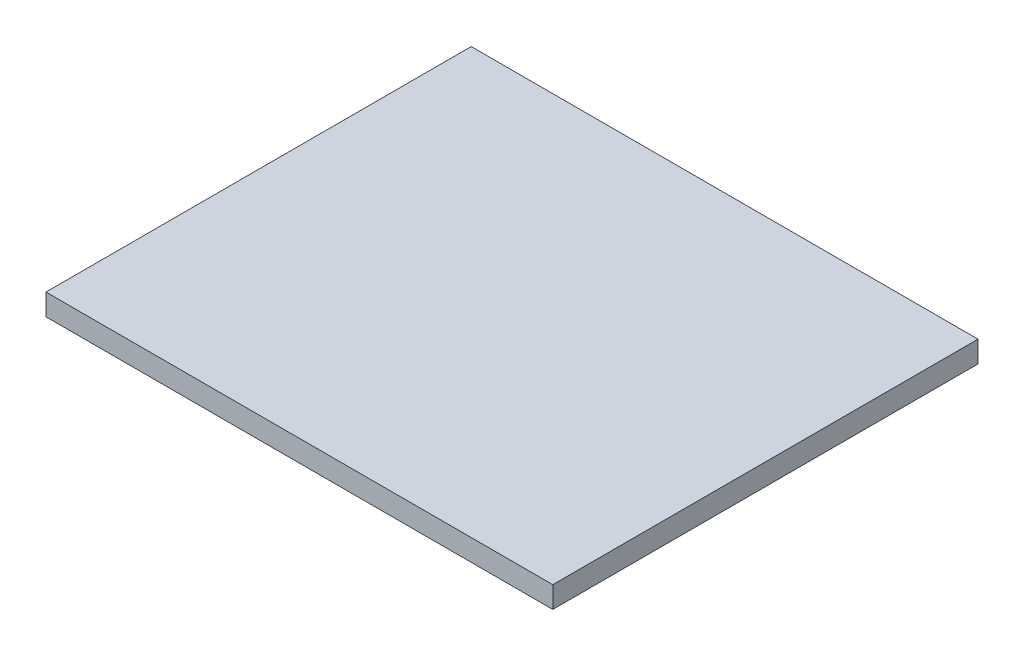
ISO-10303-21;
HEADER;
FILE_DESCRIPTION(('STEP AP214'),'2;1');
FILE_NAME('part.step','',(''),(''),'','','');
FILE_SCHEMA(('AUTOMOTIVE_DESIGN { 1 0 10303 214 1 1 1 1 }'));
ENDSEC;
DATA;
#1=APPLICATION_CONTEXT('core data for automotive mechanical design processes');
#2=APPLICATION_PROTOCOL_DEFINITION('international standard','automotive_design',2000,#1);
#3=PRODUCT_CONTEXT('',#1,'mechanical');
#4=PRODUCT('Part','Part','',(#3));
#5=PRODUCT_RELATED_PRODUCT_CATEGORY('part','',(#4));
#6=PRODUCT_DEFINITION_FORMATION('','',#4);
#7=PRODUCT_DEFINITION_CONTEXT('part definition',#1,'design');
#8=PRODUCT_DEFINITION('design','',#6,#7);
#9=PRODUCT_DEFINITION_SHAPE('','',#8);
#10=(LENGTH_UNIT() NAMED_UNIT(*) SI_UNIT(.MILLI.,.METRE.));
#11=(NAMED_UNIT(*) PLANE_ANGLE_UNIT() SI_UNIT($,.RADIAN.));
#12=(NAMED_UNIT(*) SI_UNIT($,.STERADIAN.) SOLID_ANGLE_UNIT());
#13=UNCERTAINTY_MEASURE_WITH_UNIT(LENGTH_MEASURE(1.E-05),#10,'distance_accuracy_value','');
#14=(GEOMETRIC_REPRESENTATION_CONTEXT(3) GLOBAL_UNCERTAINTY_ASSIGNED_CONTEXT((#13)) GLOBAL_UNIT_ASSIGNED_CONTEXT((#10,
#11,#12)) REPRESENTATION_CONTEXT('',''));
#15=CARTESIAN_POINT('',(0.,0.,0.));
#16=DIRECTION('',(0.,0.,1.));
#17=DIRECTION('',(1.,0.,0.));
#18=AXIS2_PLACEMENT_3D('',#15,#16,#17);
#19=CARTESIAN_POINT('',(0.,0.,0.));
#20=DIRECTION('',(0.,1.,0.));
#21=DIRECTION('',(0.,0.,1.));
#22=AXIS2_PLACEMENT_3D('',#19,#20,#21);
#23=PLANE('',#22);
#24=DIRECTION('',(0.,0.,-1.));
#25=VECTOR('',#24,1.);
#26=CARTESIAN_POINT('',(29.5,0.,-24.75));
#27=LINE('',#26,#25);
#28=CARTESIAN_POINT('',(29.5,0.,24.75));
#29=VERTEX_POINT('',#28);
#30=CARTESIAN_POINT('',(29.5,0.,-24.75));
#31=VERTEX_POINT('',#30);
#32=EDGE_CURVE('E143',#29,#31,#27,.T.);
#33=ORIENTED_EDGE('',*,*,#32,.F.);
#34=DIRECTION('',(1.,0.,0.));
#35=VECTOR('',#34,1.);
#36=CARTESIAN_POINT('',(-29.5,0.,24.75));
#37=LINE('',#36,#35);
#38=CARTESIAN_POINT('',(-29.5,0.,24.75));
#39=VERTEX_POINT('',#38);
#40=EDGE_CURVE('E149',#39,#29,#37,.T.);
#41=ORIENTED_EDGE('',*,*,#40,.F.);
#42=DIRECTION('',(0.,0.,1.));
#43=VECTOR('',#42,1.);
#44=CARTESIAN_POINT('',(-29.5,0.,-24.75));
#45=LINE('',#44,#43);
#46=CARTESIAN_POINT('',(-29.5,0.,-24.75));
#47=VERTEX_POINT('',#46);
#48=EDGE_CURVE('E147',#47,#39,#45,.T.);
#49=ORIENTED_EDGE('',*,*,#48,.F.);
#50=DIRECTION('',(-1.,0.,0.));
#51=VECTOR('',#50,1.);
#52=CARTESIAN_POINT('',(-29.5,0.,-24.75));
#53=LINE('',#52,#51);
#54=EDGE_CURVE('E124',#31,#47,#53,.T.);
#55=ORIENTED_EDGE('',*,*,#54,.F.);
#56=EDGE_LOOP('',(#33,#41,#49,#55));
#57=FACE_BOUND('',#56,.T.);
#58=DIRECTION('',(0.,0.,-1.));
#59=VECTOR('',#58,1.);
#60=CARTESIAN_POINT('',(-1.75,0.,2.43669858620224));
#61=LINE('',#60,#59);
#62=CARTESIAN_POINT('',(-1.75,0.,6.50000000000001));
#63=VERTEX_POINT('',#62);
#64=CARTESIAN_POINT('',(-1.75,0.,2.43669858620224));
#65=VERTEX_POINT('',#64);
#66=EDGE_CURVE('E53',#63,#65,#61,.T.);
#67=ORIENTED_EDGE('',*,*,#66,.F.);
#68=DIRECTION('',(1.,0.,0.));
#69=VECTOR('',#68,1.);
#70=CARTESIAN_POINT('',(0.,0.,6.50000000000001));
#71=LINE('',#70,#69);
#72=CARTESIAN_POINT('',(1.75,0.,6.50000000000001));
#73=VERTEX_POINT('',#72);
#74=EDGE_CURVE('E156',#63,#73,#71,.T.);
#75=ORIENTED_EDGE('',*,*,#74,.T.);
#76=DIRECTION('',(0.,0.,1.));
#77=VECTOR('',#76,1.);
#78=CARTESIAN_POINT('',(1.75,0.,2.43669858620224));
#79=LINE('',#78,#77);
#80=CARTESIAN_POINT('',(1.75,0.,2.43669858620224));
#81=VERTEX_POINT('',#80);
#82=EDGE_CURVE('E60',#81,#73,#79,.T.);
#83=ORIENTED_EDGE('',*,*,#82,.F.);
#84=CARTESIAN_POINT('',(0.,0.,0.));
#85=DIRECTION('',(0.,1.,0.));
#86=DIRECTION('',(0.,0.,1.));
#87=AXIS2_PLACEMENT_3D('',#84,#85,#86);
#88=CIRCLE('',#87,3.);
#89=EDGE_CURVE('E135',#81,#65,#88,.T.);
#90=ORIENTED_EDGE('',*,*,#89,.T.);
#91=EDGE_LOOP('',(#67,#75,#83,#90));
#92=FACE_BOUND('',#91,.T.);
#93=ADVANCED_FACE('F37',(#57,#92),#23,.F.);
#94=CARTESIAN_POINT('',(29.5,1.5,-24.75));
#95=DIRECTION('',(-1.,0.,0.));
#96=DIRECTION('',(0.,0.,1.));
#97=AXIS2_PLACEMENT_3D('',#94,#95,#96);
#98=PLANE('',#97);
#99=ORIENTED_EDGE('',*,*,#32,.T.);
#100=DIRECTION('',(0.,-1.,0.));
#101=VECTOR('',#100,1.);
#102=CARTESIAN_POINT('',(29.5,1.5,-24.75));
#103=LINE('',#102,#101);
#104=CARTESIAN_POINT('',(29.5,2.5,-24.75));
#105=VERTEX_POINT('',#104);
#106=EDGE_CURVE('E127',#105,#31,#103,.T.);
#107=ORIENTED_EDGE('',*,*,#106,.F.);
#108=DIRECTION('',(0.,0.,-1.));
#109=VECTOR('',#108,1.);
#110=CARTESIAN_POINT('',(29.5,2.5,83.8029423483707));
#111=LINE('',#110,#109);
#112=CARTESIAN_POINT('',(29.5,2.5,24.75));
#113=VERTEX_POINT('',#112);
#114=EDGE_CURVE('E114',#113,#105,#111,.T.);
#115=ORIENTED_EDGE('',*,*,#114,.F.);
#116=DIRECTION('',(0.,-1.,0.));
#117=VECTOR('',#116,1.);
#118=CARTESIAN_POINT('',(29.5,1.5,24.75));
#119=LINE('',#118,#117);
#120=EDGE_CURVE('E151',#113,#29,#119,.T.);
#121=ORIENTED_EDGE('',*,*,#120,.T.);
#122=EDGE_LOOP('',(#99,#107,#115,#121));
#123=FACE_BOUND('',#122,.T.);
#124=ADVANCED_FACE('F212',(#123),#98,.F.);
#125=CARTESIAN_POINT('',(-29.5,1.5,-24.75));
#126=DIRECTION('',(0.,0.,1.));
#127=DIRECTION('',(1.,0.,0.));
#128=AXIS2_PLACEMENT_3D('',#125,#126,#127);
#129=PLANE('',#128);
#130=DIRECTION('',(0.,-1.,0.));
#131=VECTOR('',#130,1.);
#132=CARTESIAN_POINT('',(-29.5,1.5,-24.75));
#133=LINE('',#132,#131);
#134=CARTESIAN_POINT('',(-29.5,2.5,-24.75));
#135=VERTEX_POINT('',#134);
#136=EDGE_CURVE('E122',#135,#47,#133,.T.);
#137=ORIENTED_EDGE('',*,*,#136,.F.);
#138=DIRECTION('',(1.,0.,0.));
#139=VECTOR('',#138,1.);
#140=CARTESIAN_POINT('',(-29.5,2.5,-24.75));
#141=LINE('',#140,#139);
#142=EDGE_CURVE('E107',#135,#105,#141,.T.);
#143=ORIENTED_EDGE('',*,*,#142,.T.);
#144=ORIENTED_EDGE('',*,*,#106,.T.);
#145=ORIENTED_EDGE('',*,*,#54,.T.);
#146=EDGE_LOOP('',(#137,#143,#144,#145));
#147=FACE_BOUND('',#146,.T.);
#148=ADVANCED_FACE('F123',(#147),#129,.F.);
#149=CARTESIAN_POINT('',(-29.5,1.5,-24.75));
#150=DIRECTION('',(1.,0.,0.));
#151=DIRECTION('',(0.,0.,-1.));
#152=AXIS2_PLACEMENT_3D('',#149,#150,#151);
#153=PLANE('',#152);
#154=ORIENTED_EDGE('',*,*,#48,.T.);
#155=DIRECTION('',(0.,-1.,0.));
#156=VECTOR('',#155,1.);
#157=CARTESIAN_POINT('',(-29.5,1.5,24.75));
#158=LINE('',#157,#156);
#159=CARTESIAN_POINT('',(-29.5,2.5,24.75));
#160=VERTEX_POINT('',#159);
#161=EDGE_CURVE('E128',#160,#39,#158,.T.);
#162=ORIENTED_EDGE('',*,*,#161,.F.);
#163=DIRECTION('',(0.,0.,-1.));
#164=VECTOR('',#163,1.);
#165=CARTESIAN_POINT('',(-29.5,2.5,83.8029423483707));
#166=LINE('',#165,#164);
#167=EDGE_CURVE('E111',#160,#135,#166,.T.);
#168=ORIENTED_EDGE('',*,*,#167,.T.);
#169=ORIENTED_EDGE('',*,*,#136,.T.);
#170=EDGE_LOOP('',(#154,#162,#168,#169));
#171=FACE_BOUND('',#170,.T.);
#172=ADVANCED_FACE('F131',(#171),#153,.F.);
#173=CARTESIAN_POINT('',(-29.5,1.5,24.75));
#174=DIRECTION('',(0.,0.,-1.));
#175=DIRECTION('',(-1.,0.,0.));
#176=AXIS2_PLACEMENT_3D('',#173,#174,#175);
#177=PLANE('',#176);
#178=ORIENTED_EDGE('',*,*,#120,.F.);
#179=DIRECTION('',(1.,0.,0.));
#180=VECTOR('',#179,1.);
#181=CARTESIAN_POINT('',(-29.5,2.5,24.75));
#182=LINE('',#181,#180);
#183=EDGE_CURVE('E119',#160,#113,#182,.T.);
#184=ORIENTED_EDGE('',*,*,#183,.F.);
#185=ORIENTED_EDGE('',*,*,#161,.T.);
#186=ORIENTED_EDGE('',*,*,#40,.T.);
#187=EDGE_LOOP('',(#178,#184,#185,#186));
#188=FACE_BOUND('',#187,.T.);
#189=ADVANCED_FACE('F222',(#188),#177,.F.);
#190=CARTESIAN_POINT('',(0.,1.5,0.));
#191=DIRECTION('',(0.,-1.,0.));
#192=DIRECTION('',(0.,0.,-1.));
#193=AXIS2_PLACEMENT_3D('',#190,#191,#192);
#194=CYLINDRICAL_SURFACE('',#193,3.);
#195=CARTESIAN_POINT('',(0.,1.,0.));
#196=DIRECTION('',(0.,-1.,0.));
#197=DIRECTION('',(0.,0.,-1.));
#198=AXIS2_PLACEMENT_3D('',#195,#196,#197);
#199=CIRCLE('',#198,3.);
#200=CARTESIAN_POINT('',(-1.75,1.,2.43669858620224));
#201=VERTEX_POINT('',#200);
#202=CARTESIAN_POINT('',(1.75,1.,2.43669858620224));
#203=VERTEX_POINT('',#202);
#204=EDGE_CURVE('E169',#201,#203,#199,.T.);
#205=ORIENTED_EDGE('',*,*,#204,.F.);
#206=DIRECTION('',(0.,-1.,0.));
#207=VECTOR('',#206,1.);
#208=CARTESIAN_POINT('',(-1.75,1.,2.43669858620224));
#209=LINE('',#208,#207);
#210=EDGE_CURVE('E133',#201,#65,#209,.T.);
#211=ORIENTED_EDGE('',*,*,#210,.T.);
#212=ORIENTED_EDGE('',*,*,#89,.F.);
#213=DIRECTION('',(0.,-1.,0.));
#214=VECTOR('',#213,1.);
#215=CARTESIAN_POINT('',(1.75,1.,2.43669858620224));
#216=LINE('',#215,#214);
#217=EDGE_CURVE('E138',#203,#81,#216,.T.);
#218=ORIENTED_EDGE('',*,*,#217,.F.);
#219=EDGE_LOOP('',(#205,#211,#212,#218));
#220=FACE_BOUND('',#219,.T.);
#221=ADVANCED_FACE('F174',(#220),#194,.F.);
#222=CARTESIAN_POINT('',(-1.75,1.,2.43669858620224));
#223=DIRECTION('',(-1.,0.,0.));
#224=DIRECTION('',(0.,0.,1.));
#225=AXIS2_PLACEMENT_3D('',#222,#223,#224);
#226=PLANE('',#225);
#227=ORIENTED_EDGE('',*,*,#66,.T.);
#228=ORIENTED_EDGE('',*,*,#210,.F.);
#229=DIRECTION('',(0.,-1.,0.));
#230=VECTOR('',#229,1.);
#231=CARTESIAN_POINT('',(-1.75,1.5,2.43669858620224));
#232=LINE('',#231,#230);
#233=CARTESIAN_POINT('',(-1.75,1.5,2.43669858620224));
#234=VERTEX_POINT('',#233);
#235=EDGE_CURVE('E176',#234,#201,#232,.T.);
#236=ORIENTED_EDGE('',*,*,#235,.F.);
#237=DIRECTION('',(0.,0.,-1.));
#238=VECTOR('',#237,1.);
#239=CARTESIAN_POINT('',(-1.75,1.5,5.));
#240=LINE('',#239,#238);
#241=CARTESIAN_POINT('',(-1.75,1.5,5.));
#242=VERTEX_POINT('',#241);
#243=EDGE_CURVE('E163',#242,#234,#240,.T.);
#244=ORIENTED_EDGE('',*,*,#243,.F.);
#245=DIRECTION('',(0.,0.707106781186546,-0.707106781186549));
#246=VECTOR('',#245,1.);
#247=CARTESIAN_POINT('',(-1.75,2.53165070689888,3.96834929310112));
#248=LINE('',#247,#246);
#249=EDGE_CURVE('E46',#242,#63,#248,.F.);
#250=ORIENTED_EDGE('',*,*,#249,.T.);
#251=EDGE_LOOP('',(#227,#228,#236,#244,#250));
#252=FACE_BOUND('',#251,.T.);
#253=ADVANCED_FACE('F160',(#252),#226,.F.);
#254=CARTESIAN_POINT('',(1.75,1.,2.43669858620224));
#255=DIRECTION('',(1.,0.,0.));
#256=DIRECTION('',(0.,0.,-1.));
#257=AXIS2_PLACEMENT_3D('',#254,#255,#256);
#258=PLANE('',#257);
#259=ORIENTED_EDGE('',*,*,#82,.T.);
#260=DIRECTION('',(0.,-0.707106781186546,0.707106781186549));
#261=VECTOR('',#260,1.);
#262=CARTESIAN_POINT('',(1.75,2.53165070689888,3.96834929310112));
#263=LINE('',#262,#261);
#264=CARTESIAN_POINT('',(1.75,1.5,5.));
#265=VERTEX_POINT('',#264);
#266=EDGE_CURVE('E11',#73,#265,#263,.F.);
#267=ORIENTED_EDGE('',*,*,#266,.T.);
#268=DIRECTION('',(0.,0.,1.));
#269=VECTOR('',#268,1.);
#270=CARTESIAN_POINT('',(1.75,1.5,5.));
#271=LINE('',#270,#269);
#272=CARTESIAN_POINT('',(1.75,1.5,2.43669858620224));
#273=VERTEX_POINT('',#272);
#274=EDGE_CURVE('E196',#273,#265,#271,.T.);
#275=ORIENTED_EDGE('',*,*,#274,.F.);
#276=DIRECTION('',(0.,-1.,0.));
#277=VECTOR('',#276,1.);
#278=CARTESIAN_POINT('',(1.75,1.5,2.43669858620224));
#279=LINE('',#278,#277);
#280=EDGE_CURVE('E181',#273,#203,#279,.T.);
#281=ORIENTED_EDGE('',*,*,#280,.T.);
#282=ORIENTED_EDGE('',*,*,#217,.T.);
#283=EDGE_LOOP('',(#259,#267,#275,#281,#282));
#284=FACE_BOUND('',#283,.T.);
#285=ADVANCED_FACE('F199',(#284),#258,.F.);
#286=CARTESIAN_POINT('',(0.,1.,0.));
#287=DIRECTION('',(0.,-1.,0.));
#288=DIRECTION('',(0.,0.,-1.));
#289=AXIS2_PLACEMENT_3D('',#286,#287,#288);
#290=PLANE('',#289);
#291=DIRECTION('',(1.,0.,0.));
#292=VECTOR('',#291,1.);
#293=CARTESIAN_POINT('',(1.75,1.,2.43669858620224));
#294=LINE('',#293,#292);
#295=EDGE_CURVE('E118',#201,#203,#294,.T.);
#296=ORIENTED_EDGE('',*,*,#295,.F.);
#297=ORIENTED_EDGE('',*,*,#204,.T.);
#298=EDGE_LOOP('',(#296,#297));
#299=FACE_BOUND('',#298,.T.);
#300=ADVANCED_FACE('F201',(#299),#290,.T.);
#301=CARTESIAN_POINT('',(1.75,1.5,2.43669858620224));
#302=DIRECTION('',(0.,0.,-1.));
#303=DIRECTION('',(-1.,0.,0.));
#304=AXIS2_PLACEMENT_3D('',#301,#302,#303);
#305=PLANE('',#304);
#306=ORIENTED_EDGE('',*,*,#295,.T.);
#307=ORIENTED_EDGE('',*,*,#280,.F.);
#308=DIRECTION('',(1.,0.,0.));
#309=VECTOR('',#308,1.);
#310=CARTESIAN_POINT('',(1.75,1.5,2.43669858620224));
#311=LINE('',#310,#309);
#312=EDGE_CURVE('E182',#234,#273,#311,.T.);
#313=ORIENTED_EDGE('',*,*,#312,.F.);
#314=ORIENTED_EDGE('',*,*,#235,.T.);
#315=EDGE_LOOP('',(#306,#307,#313,#314));
#316=FACE_BOUND('',#315,.T.);
#317=ADVANCED_FACE('F190',(#316),#305,.F.);
#318=CARTESIAN_POINT('',(0.,1.5,0.));
#319=DIRECTION('',(0.,1.,0.));
#320=DIRECTION('',(0.,0.,1.));
#321=AXIS2_PLACEMENT_3D('',#318,#319,#320);
#322=PLANE('',#321);
#323=ORIENTED_EDGE('',*,*,#274,.T.);
#324=DIRECTION('',(-1.,0.,0.));
#325=VECTOR('',#324,1.);
#326=CARTESIAN_POINT('',(1.75,1.5,5.));
#327=LINE('',#326,#325);
#328=EDGE_CURVE('E188',#265,#242,#327,.T.);
#329=ORIENTED_EDGE('',*,*,#328,.T.);
#330=ORIENTED_EDGE('',*,*,#243,.T.);
#331=ORIENTED_EDGE('',*,*,#312,.T.);
#332=EDGE_LOOP('',(#323,#329,#330,#331));
#333=FACE_BOUND('',#332,.T.);
#334=ADVANCED_FACE('F187',(#333),#322,.F.);
#335=CARTESIAN_POINT('',(1.75,1.5,5.));
#336=DIRECTION('',(0.,0.707106781186549,0.707106781186546));
#337=DIRECTION('',(-1.,0.,0.));
#338=AXIS2_PLACEMENT_3D('',#335,#336,#337);
#339=PLANE('',#338);
#340=ORIENTED_EDGE('',*,*,#266,.F.);
#341=ORIENTED_EDGE('',*,*,#74,.F.);
#342=ORIENTED_EDGE('',*,*,#249,.F.);
#343=ORIENTED_EDGE('',*,*,#328,.F.);
#344=EDGE_LOOP('',(#340,#341,#342,#343));
#345=FACE_BOUND('',#344,.T.);
#346=ADVANCED_FACE('F40',(#345),#339,.F.);
#347=CARTESIAN_POINT('',(-29.5,2.5,-24.75));
#348=DIRECTION('',(0.,-1.,0.));
#349=DIRECTION('',(0.,0.,-1.));
#350=AXIS2_PLACEMENT_3D('',#347,#348,#349);
#351=PLANE('',#350);
#352=ORIENTED_EDGE('',*,*,#183,.T.);
#353=ORIENTED_EDGE('',*,*,#114,.T.);
#354=ORIENTED_EDGE('',*,*,#142,.F.);
#355=ORIENTED_EDGE('',*,*,#167,.F.);
#356=EDGE_LOOP('',(#352,#353,#354,#355));
#357=FACE_BOUND('',#356,.T.);
#358=ADVANCED_FACE('F109',(#357),#351,.F.);
#359=CLOSED_SHELL('',(#93,#124,#148,#172,#189,#221,#253,#285,#300,#317,#334,#346,#358));
#360=MANIFOLD_SOLID_BREP('B2',#359);
#361=ADVANCED_BREP_SHAPE_REPRESENTATION('',(#18,#360),#14);
#362=SHAPE_DEFINITION_REPRESENTATION(#9,#361);
ENDSEC;
END-ISO-10303-21;
